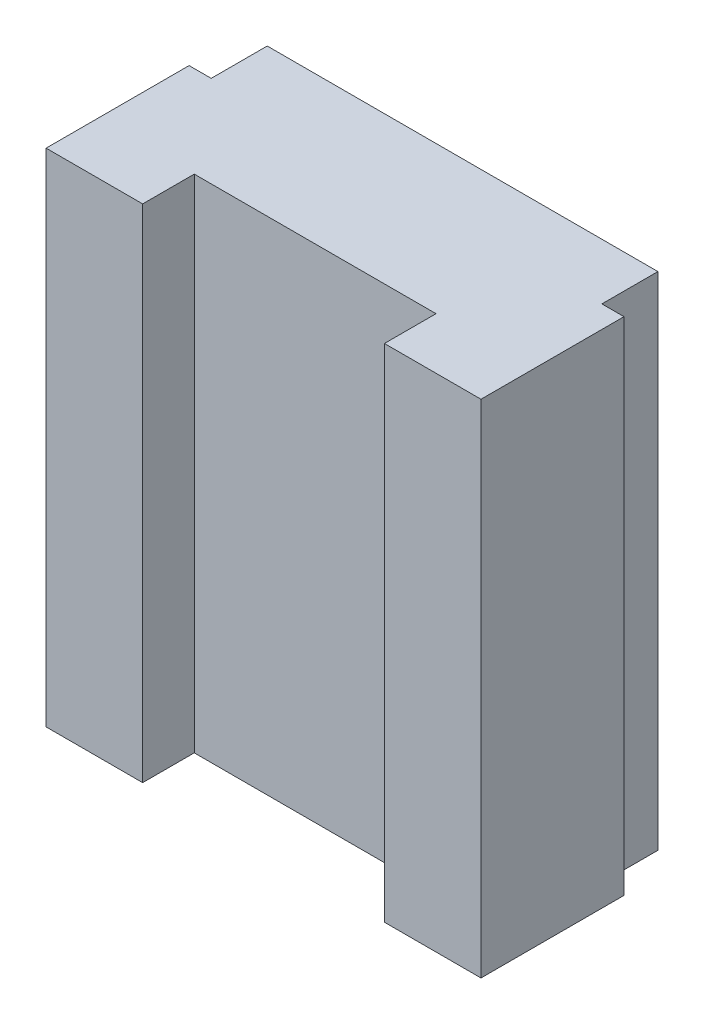
ISO-10303-21;
HEADER;
FILE_DESCRIPTION(('STEP AP214'),'2;1');
FILE_NAME('part.step','',(''),(''),'','','');
FILE_SCHEMA(('AUTOMOTIVE_DESIGN { 1 0 10303 214 1 1 1 1 }'));
ENDSEC;
DATA;
#1=APPLICATION_CONTEXT('core data for automotive mechanical design processes');
#2=APPLICATION_PROTOCOL_DEFINITION('international standard','automotive_design',2000,#1);
#3=PRODUCT_CONTEXT('',#1,'mechanical');
#4=PRODUCT('Part','Part','',(#3));
#5=PRODUCT_RELATED_PRODUCT_CATEGORY('part','',(#4));
#6=PRODUCT_DEFINITION_FORMATION('','',#4);
#7=PRODUCT_DEFINITION_CONTEXT('part definition',#1,'design');
#8=PRODUCT_DEFINITION('design','',#6,#7);
#9=PRODUCT_DEFINITION_SHAPE('','',#8);
#10=(LENGTH_UNIT() NAMED_UNIT(*) SI_UNIT(.MILLI.,.METRE.));
#11=(NAMED_UNIT(*) PLANE_ANGLE_UNIT() SI_UNIT($,.RADIAN.));
#12=(NAMED_UNIT(*) SI_UNIT($,.STERADIAN.) SOLID_ANGLE_UNIT());
#13=UNCERTAINTY_MEASURE_WITH_UNIT(LENGTH_MEASURE(1.E-05),#10,'distance_accuracy_value','');
#14=(GEOMETRIC_REPRESENTATION_CONTEXT(3) GLOBAL_UNCERTAINTY_ASSIGNED_CONTEXT((#13)) GLOBAL_UNIT_ASSIGNED_CONTEXT((#10,
#11,#12)) REPRESENTATION_CONTEXT('',''));
#15=CARTESIAN_POINT('',(0.,0.,0.));
#16=DIRECTION('',(0.,0.,1.));
#17=DIRECTION('',(1.,0.,0.));
#18=AXIS2_PLACEMENT_3D('',#15,#16,#17);
#19=CARTESIAN_POINT('',(14.75,17.,13.5));
#20=DIRECTION('',(-1.,0.,0.));
#21=DIRECTION('',(0.,-1.,0.));
#22=AXIS2_PLACEMENT_3D('',#19,#20,#21);
#23=PLANE('',#22);
#24=DIRECTION('',(0.,1.,0.));
#25=VECTOR('',#24,1.);
#26=CARTESIAN_POINT('',(14.75,-17.,3.8));
#27=LINE('',#26,#25);
#28=CARTESIAN_POINT('',(14.75,-17.,3.8));
#29=VERTEX_POINT('',#28);
#30=CARTESIAN_POINT('',(14.75,17.,3.8));
#31=VERTEX_POINT('',#30);
#32=EDGE_CURVE('E121',#29,#31,#27,.T.);
#33=ORIENTED_EDGE('',*,*,#32,.T.);
#34=DIRECTION('',(0.,0.,-1.));
#35=VECTOR('',#34,1.);
#36=CARTESIAN_POINT('',(14.75,17.,13.5));
#37=LINE('',#36,#35);
#38=CARTESIAN_POINT('',(14.75,17.,13.5));
#39=VERTEX_POINT('',#38);
#40=EDGE_CURVE('E11',#39,#31,#37,.T.);
#41=ORIENTED_EDGE('',*,*,#40,.F.);
#42=DIRECTION('',(0.,1.,0.));
#43=VECTOR('',#42,1.);
#44=CARTESIAN_POINT('',(14.75,17.,13.5));
#45=LINE('',#44,#43);
#46=CARTESIAN_POINT('',(14.75,-17.,13.5));
#47=VERTEX_POINT('',#46);
#48=EDGE_CURVE('E143',#47,#39,#45,.T.);
#49=ORIENTED_EDGE('',*,*,#48,.F.);
#50=DIRECTION('',(0.,0.,-1.));
#51=VECTOR('',#50,1.);
#52=CARTESIAN_POINT('',(14.75,-17.,13.5));
#53=LINE('',#52,#51);
#54=EDGE_CURVE('E137',#47,#29,#53,.T.);
#55=ORIENTED_EDGE('',*,*,#54,.T.);
#56=EDGE_LOOP('',(#33,#41,#49,#55));
#57=FACE_BOUND('',#56,.T.);
#58=ADVANCED_FACE('F33',(#57),#23,.F.);
#59=CARTESIAN_POINT('',(-14.75,17.,13.5));
#60=DIRECTION('',(0.,-1.,0.));
#61=DIRECTION('',(0.,0.,-1.));
#62=AXIS2_PLACEMENT_3D('',#59,#60,#61);
#63=PLANE('',#62);
#64=DIRECTION('',(-1.,0.,0.));
#65=VECTOR('',#64,1.);
#66=CARTESIAN_POINT('',(14.75,17.,3.8));
#67=LINE('',#66,#65);
#68=CARTESIAN_POINT('',(13.25,17.,3.8));
#69=VERTEX_POINT('',#68);
#70=EDGE_CURVE('E127',#31,#69,#67,.T.);
#71=ORIENTED_EDGE('',*,*,#70,.T.);
#72=DIRECTION('',(0.,0.,-1.));
#73=VECTOR('',#72,1.);
#74=CARTESIAN_POINT('',(13.25,17.,3.8));
#75=LINE('',#74,#73);
#76=CARTESIAN_POINT('',(13.25,17.,0.));
#77=VERTEX_POINT('',#76);
#78=EDGE_CURVE('E140',#69,#77,#75,.T.);
#79=ORIENTED_EDGE('',*,*,#78,.T.);
#80=DIRECTION('',(-1.,0.,0.));
#81=VECTOR('',#80,1.);
#82=CARTESIAN_POINT('',(-14.75,17.,0.));
#83=LINE('',#82,#81);
#84=CARTESIAN_POINT('',(-13.25,17.,0.));
#85=VERTEX_POINT('',#84);
#86=EDGE_CURVE('E186',#77,#85,#83,.T.);
#87=ORIENTED_EDGE('',*,*,#86,.T.);
#88=DIRECTION('',(0.,0.,-1.));
#89=VECTOR('',#88,1.);
#90=CARTESIAN_POINT('',(-13.25,17.,3.8));
#91=LINE('',#90,#89);
#92=CARTESIAN_POINT('',(-13.25,17.,3.8));
#93=VERTEX_POINT('',#92);
#94=EDGE_CURVE('E173',#93,#85,#91,.T.);
#95=ORIENTED_EDGE('',*,*,#94,.F.);
#96=DIRECTION('',(1.,0.,0.));
#97=VECTOR('',#96,1.);
#98=CARTESIAN_POINT('',(-14.75,17.,3.8));
#99=LINE('',#98,#97);
#100=CARTESIAN_POINT('',(-14.75,17.,3.8));
#101=VERTEX_POINT('',#100);
#102=EDGE_CURVE('E171',#101,#93,#99,.T.);
#103=ORIENTED_EDGE('',*,*,#102,.F.);
#104=DIRECTION('',(0.,0.,-1.));
#105=VECTOR('',#104,1.);
#106=CARTESIAN_POINT('',(-14.75,17.,13.5));
#107=LINE('',#106,#105);
#108=CARTESIAN_POINT('',(-14.75,17.,13.5));
#109=VERTEX_POINT('',#108);
#110=EDGE_CURVE('E40',#109,#101,#107,.T.);
#111=ORIENTED_EDGE('',*,*,#110,.F.);
#112=DIRECTION('',(-1.,0.,0.));
#113=VECTOR('',#112,1.);
#114=CARTESIAN_POINT('',(-14.75,17.,13.5));
#115=LINE('',#114,#113);
#116=CARTESIAN_POINT('',(-8.19999999999999,17.,13.5));
#117=VERTEX_POINT('',#116);
#118=EDGE_CURVE('E168',#117,#109,#115,.T.);
#119=ORIENTED_EDGE('',*,*,#118,.F.);
#120=DIRECTION('',(0.,0.,1.));
#121=VECTOR('',#120,1.);
#122=CARTESIAN_POINT('',(-8.19999999999999,17.,10.));
#123=LINE('',#122,#121);
#124=CARTESIAN_POINT('',(-8.19999999999999,17.,10.));
#125=VERTEX_POINT('',#124);
#126=EDGE_CURVE('E55',#125,#117,#123,.T.);
#127=ORIENTED_EDGE('',*,*,#126,.F.);
#128=DIRECTION('',(-1.,0.,0.));
#129=VECTOR('',#128,1.);
#130=CARTESIAN_POINT('',(-8.19999999999999,17.,10.));
#131=LINE('',#130,#129);
#132=CARTESIAN_POINT('',(8.2,17.,10.));
#133=VERTEX_POINT('',#132);
#134=EDGE_CURVE('E205',#133,#125,#131,.T.);
#135=ORIENTED_EDGE('',*,*,#134,.F.);
#136=DIRECTION('',(0.,0.,-1.));
#137=VECTOR('',#136,1.);
#138=CARTESIAN_POINT('',(8.2,17.,10.));
#139=LINE('',#138,#137);
#140=CARTESIAN_POINT('',(8.2,17.,13.5));
#141=VERTEX_POINT('',#140);
#142=EDGE_CURVE('E202',#141,#133,#139,.T.);
#143=ORIENTED_EDGE('',*,*,#142,.F.);
#144=EDGE_CURVE('E215',#39,#141,#115,.T.);
#145=ORIENTED_EDGE('',*,*,#144,.F.);
#146=ORIENTED_EDGE('',*,*,#40,.T.);
#147=EDGE_LOOP('',(#71,#79,#87,#95,#103,#111,#119,#127,#135,#143,#145,#146));
#148=FACE_BOUND('',#147,.T.);
#149=ADVANCED_FACE('F167',(#148),#63,.F.);
#150=CARTESIAN_POINT('',(-14.75,-17.,13.5));
#151=DIRECTION('',(0.,1.,0.));
#152=DIRECTION('',(0.,0.,1.));
#153=AXIS2_PLACEMENT_3D('',#150,#151,#152);
#154=PLANE('',#153);
#155=DIRECTION('',(-1.,0.,0.));
#156=VECTOR('',#155,1.);
#157=CARTESIAN_POINT('',(14.75,-17.,3.8));
#158=LINE('',#157,#156);
#159=CARTESIAN_POINT('',(13.25,-17.,3.8));
#160=VERTEX_POINT('',#159);
#161=EDGE_CURVE('E125',#29,#160,#158,.T.);
#162=ORIENTED_EDGE('',*,*,#161,.F.);
#163=ORIENTED_EDGE('',*,*,#54,.F.);
#164=DIRECTION('',(1.,0.,0.));
#165=VECTOR('',#164,1.);
#166=CARTESIAN_POINT('',(-14.75,-17.,13.5));
#167=LINE('',#166,#165);
#168=CARTESIAN_POINT('',(8.2,-17.,13.5));
#169=VERTEX_POINT('',#168);
#170=EDGE_CURVE('E150',#169,#47,#167,.T.);
#171=ORIENTED_EDGE('',*,*,#170,.F.);
#172=DIRECTION('',(0.,0.,-1.));
#173=VECTOR('',#172,1.);
#174=CARTESIAN_POINT('',(8.2,-17.,10.));
#175=LINE('',#174,#173);
#176=CARTESIAN_POINT('',(8.2,-17.,10.));
#177=VERTEX_POINT('',#176);
#178=EDGE_CURVE('E192',#169,#177,#175,.T.);
#179=ORIENTED_EDGE('',*,*,#178,.T.);
#180=DIRECTION('',(-1.,0.,0.));
#181=VECTOR('',#180,1.);
#182=CARTESIAN_POINT('',(-8.19999999999999,-17.,10.));
#183=LINE('',#182,#181);
#184=CARTESIAN_POINT('',(-8.19999999999999,-17.,10.));
#185=VERTEX_POINT('',#184);
#186=EDGE_CURVE('E195',#177,#185,#183,.T.);
#187=ORIENTED_EDGE('',*,*,#186,.T.);
#188=DIRECTION('',(0.,0.,1.));
#189=VECTOR('',#188,1.);
#190=CARTESIAN_POINT('',(-8.19999999999999,-17.,10.));
#191=LINE('',#190,#189);
#192=CARTESIAN_POINT('',(-8.19999999999999,-17.,13.5));
#193=VERTEX_POINT('',#192);
#194=EDGE_CURVE('E198',#185,#193,#191,.T.);
#195=ORIENTED_EDGE('',*,*,#194,.T.);
#196=CARTESIAN_POINT('',(-14.75,-17.,13.5));
#197=VERTEX_POINT('',#196);
#198=EDGE_CURVE('E145',#197,#193,#167,.T.);
#199=ORIENTED_EDGE('',*,*,#198,.F.);
#200=DIRECTION('',(0.,0.,-1.));
#201=VECTOR('',#200,1.);
#202=CARTESIAN_POINT('',(-14.75,-17.,13.5));
#203=LINE('',#202,#201);
#204=CARTESIAN_POINT('',(-14.75,-17.,3.8));
#205=VERTEX_POINT('',#204);
#206=EDGE_CURVE('E144',#197,#205,#203,.T.);
#207=ORIENTED_EDGE('',*,*,#206,.T.);
#208=DIRECTION('',(1.,0.,0.));
#209=VECTOR('',#208,1.);
#210=CARTESIAN_POINT('',(-14.75,-17.,3.8));
#211=LINE('',#210,#209);
#212=CARTESIAN_POINT('',(-13.25,-17.,3.8));
#213=VERTEX_POINT('',#212);
#214=EDGE_CURVE('E177',#205,#213,#211,.T.);
#215=ORIENTED_EDGE('',*,*,#214,.T.);
#216=DIRECTION('',(0.,0.,-1.));
#217=VECTOR('',#216,1.);
#218=CARTESIAN_POINT('',(-13.25,-17.,3.8));
#219=LINE('',#218,#217);
#220=CARTESIAN_POINT('',(-13.25,-17.,0.));
#221=VERTEX_POINT('',#220);
#222=EDGE_CURVE('E182',#213,#221,#219,.T.);
#223=ORIENTED_EDGE('',*,*,#222,.T.);
#224=DIRECTION('',(1.,0.,0.));
#225=VECTOR('',#224,1.);
#226=CARTESIAN_POINT('',(-14.75,-17.,0.));
#227=LINE('',#226,#225);
#228=CARTESIAN_POINT('',(13.25,-17.,0.));
#229=VERTEX_POINT('',#228);
#230=EDGE_CURVE('E153',#221,#229,#227,.T.);
#231=ORIENTED_EDGE('',*,*,#230,.T.);
#232=DIRECTION('',(0.,0.,-1.));
#233=VECTOR('',#232,1.);
#234=CARTESIAN_POINT('',(13.25,-17.,3.8));
#235=LINE('',#234,#233);
#236=EDGE_CURVE('E47',#160,#229,#235,.T.);
#237=ORIENTED_EDGE('',*,*,#236,.F.);
#238=EDGE_LOOP('',(#162,#163,#171,#179,#187,#195,#199,#207,#215,#223,#231,#237));
#239=FACE_BOUND('',#238,.T.);
#240=ADVANCED_FACE('F135',(#239),#154,.F.);
#241=CARTESIAN_POINT('',(0.,0.,0.));
#242=DIRECTION('',(0.,0.,1.));
#243=DIRECTION('',(1.,0.,0.));
#244=AXIS2_PLACEMENT_3D('',#241,#242,#243);
#245=PLANE('',#244);
#246=DIRECTION('',(0.,1.,0.));
#247=VECTOR('',#246,1.);
#248=CARTESIAN_POINT('',(13.25,-17.,0.));
#249=LINE('',#248,#247);
#250=EDGE_CURVE('E131',#229,#77,#249,.T.);
#251=ORIENTED_EDGE('',*,*,#250,.F.);
#252=ORIENTED_EDGE('',*,*,#230,.F.);
#253=DIRECTION('',(0.,1.,0.));
#254=VECTOR('',#253,1.);
#255=CARTESIAN_POINT('',(-13.25,-17.,0.));
#256=LINE('',#255,#254);
#257=EDGE_CURVE('E187',#221,#85,#256,.T.);
#258=ORIENTED_EDGE('',*,*,#257,.T.);
#259=ORIENTED_EDGE('',*,*,#86,.F.);
#260=EDGE_LOOP('',(#251,#252,#258,#259));
#261=FACE_BOUND('',#260,.T.);
#262=ADVANCED_FACE('F225',(#261),#245,.F.);
#263=CARTESIAN_POINT('',(0.,0.,13.5));
#264=DIRECTION('',(0.,0.,1.));
#265=DIRECTION('',(1.,0.,0.));
#266=AXIS2_PLACEMENT_3D('',#263,#264,#265);
#267=PLANE('',#266);
#268=DIRECTION('',(0.,1.,0.));
#269=VECTOR('',#268,1.);
#270=CARTESIAN_POINT('',(8.2,-17.,13.5));
#271=LINE('',#270,#269);
#272=EDGE_CURVE('E175',#169,#141,#271,.T.);
#273=ORIENTED_EDGE('',*,*,#272,.F.);
#274=ORIENTED_EDGE('',*,*,#170,.T.);
#275=ORIENTED_EDGE('',*,*,#48,.T.);
#276=ORIENTED_EDGE('',*,*,#144,.T.);
#277=EDGE_LOOP('',(#273,#274,#275,#276));
#278=FACE_BOUND('',#277,.T.);
#279=ADVANCED_FACE('F256',(#278),#267,.T.);
#280=CARTESIAN_POINT('',(-14.75,17.,13.5));
#281=DIRECTION('',(1.,0.,0.));
#282=DIRECTION('',(0.,1.,0.));
#283=AXIS2_PLACEMENT_3D('',#280,#281,#282);
#284=PLANE('',#283);
#285=ORIENTED_EDGE('',*,*,#110,.T.);
#286=DIRECTION('',(0.,1.,0.));
#287=VECTOR('',#286,1.);
#288=CARTESIAN_POINT('',(-14.75,-17.,3.8));
#289=LINE('',#288,#287);
#290=EDGE_CURVE('E162',#205,#101,#289,.T.);
#291=ORIENTED_EDGE('',*,*,#290,.F.);
#292=ORIENTED_EDGE('',*,*,#206,.F.);
#293=DIRECTION('',(0.,-1.,0.));
#294=VECTOR('',#293,1.);
#295=CARTESIAN_POINT('',(-14.75,17.,13.5));
#296=LINE('',#295,#294);
#297=EDGE_CURVE('E163',#109,#197,#296,.T.);
#298=ORIENTED_EDGE('',*,*,#297,.F.);
#299=EDGE_LOOP('',(#285,#291,#292,#298));
#300=FACE_BOUND('',#299,.T.);
#301=ADVANCED_FACE('F160',(#300),#284,.F.);
#302=DIRECTION('',(0.,1.,0.));
#303=VECTOR('',#302,1.);
#304=CARTESIAN_POINT('',(-8.19999999999999,-17.,13.5));
#305=LINE('',#304,#303);
#306=EDGE_CURVE('E179',#193,#117,#305,.T.);
#307=ORIENTED_EDGE('',*,*,#306,.T.);
#308=ORIENTED_EDGE('',*,*,#118,.T.);
#309=ORIENTED_EDGE('',*,*,#297,.T.);
#310=ORIENTED_EDGE('',*,*,#198,.T.);
#311=EDGE_LOOP('',(#307,#308,#309,#310));
#312=FACE_BOUND('',#311,.T.);
#313=ADVANCED_FACE('F243',(#312),#267,.T.);
#314=CARTESIAN_POINT('',(-14.75,-17.,3.8));
#315=DIRECTION('',(0.,0.,1.));
#316=DIRECTION('',(1.,0.,0.));
#317=AXIS2_PLACEMENT_3D('',#314,#315,#316);
#318=PLANE('',#317);
#319=ORIENTED_EDGE('',*,*,#102,.T.);
#320=DIRECTION('',(0.,1.,0.));
#321=VECTOR('',#320,1.);
#322=CARTESIAN_POINT('',(-13.25,-17.,3.8));
#323=LINE('',#322,#321);
#324=EDGE_CURVE('E190',#213,#93,#323,.T.);
#325=ORIENTED_EDGE('',*,*,#324,.F.);
#326=ORIENTED_EDGE('',*,*,#214,.F.);
#327=ORIENTED_EDGE('',*,*,#290,.T.);
#328=EDGE_LOOP('',(#319,#325,#326,#327));
#329=FACE_BOUND('',#328,.T.);
#330=ADVANCED_FACE('F230',(#329),#318,.F.);
#331=CARTESIAN_POINT('',(-13.25,-17.,3.8));
#332=DIRECTION('',(1.,0.,0.));
#333=DIRECTION('',(0.,0.,-1.));
#334=AXIS2_PLACEMENT_3D('',#331,#332,#333);
#335=PLANE('',#334);
#336=ORIENTED_EDGE('',*,*,#94,.T.);
#337=ORIENTED_EDGE('',*,*,#257,.F.);
#338=ORIENTED_EDGE('',*,*,#222,.F.);
#339=ORIENTED_EDGE('',*,*,#324,.T.);
#340=EDGE_LOOP('',(#336,#337,#338,#339));
#341=FACE_BOUND('',#340,.T.);
#342=ADVANCED_FACE('F232',(#341),#335,.F.);
#343=CARTESIAN_POINT('',(8.2,-17.,10.));
#344=DIRECTION('',(1.,0.,0.));
#345=DIRECTION('',(0.,0.,-1.));
#346=AXIS2_PLACEMENT_3D('',#343,#344,#345);
#347=PLANE('',#346);
#348=ORIENTED_EDGE('',*,*,#142,.T.);
#349=DIRECTION('',(0.,1.,0.));
#350=VECTOR('',#349,1.);
#351=CARTESIAN_POINT('',(8.2,-17.,10.));
#352=LINE('',#351,#350);
#353=EDGE_CURVE('E201',#177,#133,#352,.T.);
#354=ORIENTED_EDGE('',*,*,#353,.F.);
#355=ORIENTED_EDGE('',*,*,#178,.F.);
#356=ORIENTED_EDGE('',*,*,#272,.T.);
#357=EDGE_LOOP('',(#348,#354,#355,#356));
#358=FACE_BOUND('',#357,.T.);
#359=ADVANCED_FACE('F234',(#358),#347,.F.);
#360=CARTESIAN_POINT('',(-8.19999999999999,-17.,10.));
#361=DIRECTION('',(-1.,0.,0.));
#362=DIRECTION('',(0.,0.,1.));
#363=AXIS2_PLACEMENT_3D('',#360,#361,#362);
#364=PLANE('',#363);
#365=ORIENTED_EDGE('',*,*,#126,.T.);
#366=ORIENTED_EDGE('',*,*,#306,.F.);
#367=ORIENTED_EDGE('',*,*,#194,.F.);
#368=DIRECTION('',(0.,1.,0.));
#369=VECTOR('',#368,1.);
#370=CARTESIAN_POINT('',(-8.19999999999999,-17.,10.));
#371=LINE('',#370,#369);
#372=EDGE_CURVE('E211',#185,#125,#371,.T.);
#373=ORIENTED_EDGE('',*,*,#372,.T.);
#374=EDGE_LOOP('',(#365,#366,#367,#373));
#375=FACE_BOUND('',#374,.T.);
#376=ADVANCED_FACE('F240',(#375),#364,.F.);
#377=CARTESIAN_POINT('',(-8.19999999999999,-17.,10.));
#378=DIRECTION('',(0.,0.,-1.));
#379=DIRECTION('',(-1.,0.,0.));
#380=AXIS2_PLACEMENT_3D('',#377,#378,#379);
#381=PLANE('',#380);
#382=ORIENTED_EDGE('',*,*,#134,.T.);
#383=ORIENTED_EDGE('',*,*,#372,.F.);
#384=ORIENTED_EDGE('',*,*,#186,.F.);
#385=ORIENTED_EDGE('',*,*,#353,.T.);
#386=EDGE_LOOP('',(#382,#383,#384,#385));
#387=FACE_BOUND('',#386,.T.);
#388=ADVANCED_FACE('F263',(#387),#381,.F.);
#389=CARTESIAN_POINT('',(14.75,-17.,3.8));
#390=DIRECTION('',(0.,0.,-1.));
#391=DIRECTION('',(-1.,0.,0.));
#392=AXIS2_PLACEMENT_3D('',#389,#390,#391);
#393=PLANE('',#392);
#394=ORIENTED_EDGE('',*,*,#70,.F.);
#395=ORIENTED_EDGE('',*,*,#32,.F.);
#396=ORIENTED_EDGE('',*,*,#161,.T.);
#397=DIRECTION('',(0.,1.,0.));
#398=VECTOR('',#397,1.);
#399=CARTESIAN_POINT('',(13.25,-17.,3.8));
#400=LINE('',#399,#398);
#401=EDGE_CURVE('E206',#160,#69,#400,.T.);
#402=ORIENTED_EDGE('',*,*,#401,.T.);
#403=EDGE_LOOP('',(#394,#395,#396,#402));
#404=FACE_BOUND('',#403,.T.);
#405=ADVANCED_FACE('F123',(#404),#393,.T.);
#406=CARTESIAN_POINT('',(13.25,-17.,3.8));
#407=DIRECTION('',(1.,0.,0.));
#408=DIRECTION('',(0.,0.,-1.));
#409=AXIS2_PLACEMENT_3D('',#406,#407,#408);
#410=PLANE('',#409);
#411=ORIENTED_EDGE('',*,*,#78,.F.);
#412=ORIENTED_EDGE('',*,*,#401,.F.);
#413=ORIENTED_EDGE('',*,*,#236,.T.);
#414=ORIENTED_EDGE('',*,*,#250,.T.);
#415=EDGE_LOOP('',(#411,#412,#413,#414));
#416=FACE_BOUND('',#415,.T.);
#417=ADVANCED_FACE('F282',(#416),#410,.T.);
#418=CLOSED_SHELL('',(#58,#149,#240,#262,#279,#301,#313,#330,#342,#359,#376,#388,#405,#417));
#419=MANIFOLD_SOLID_BREP('B2',#418);
#420=ADVANCED_BREP_SHAPE_REPRESENTATION('',(#18,#419),#14);
#421=SHAPE_DEFINITION_REPRESENTATION(#9,#420);
ENDSEC;
END-ISO-10303-21;
